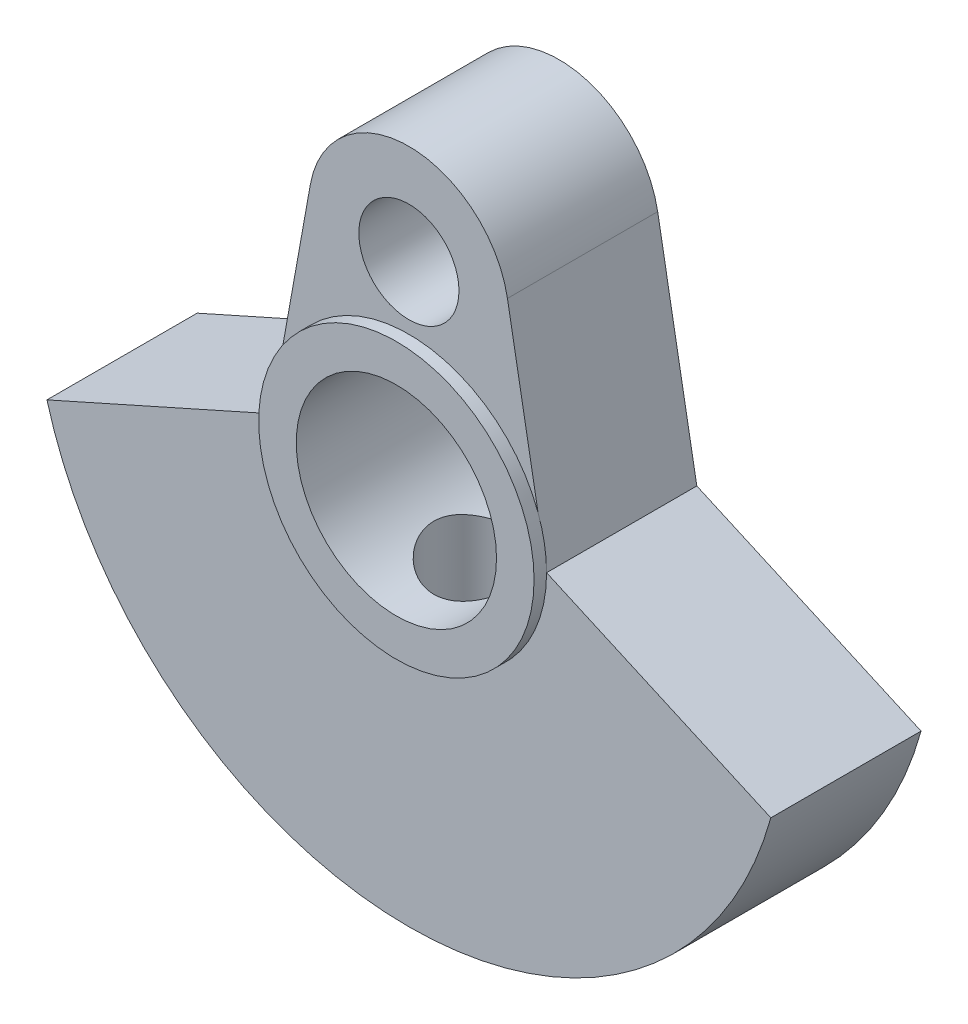
ISO-10303-21;
HEADER;
FILE_DESCRIPTION(('STEP AP214'),'2;1');
FILE_NAME('part.step','',(''),(''),'','','');
FILE_SCHEMA(('AUTOMOTIVE_DESIGN { 1 0 10303 214 1 1 1 1 }'));
ENDSEC;
DATA;
#1=APPLICATION_CONTEXT('core data for automotive mechanical design processes');
#2=APPLICATION_PROTOCOL_DEFINITION('international standard','automotive_design',2000,#1);
#3=PRODUCT_CONTEXT('',#1,'mechanical');
#4=PRODUCT('Part','Part','',(#3));
#5=PRODUCT_RELATED_PRODUCT_CATEGORY('part','',(#4));
#6=PRODUCT_DEFINITION_FORMATION('','',#4);
#7=PRODUCT_DEFINITION_CONTEXT('part definition',#1,'design');
#8=PRODUCT_DEFINITION('design','',#6,#7);
#9=PRODUCT_DEFINITION_SHAPE('','',#8);
#10=(LENGTH_UNIT() NAMED_UNIT(*) SI_UNIT(.MILLI.,.METRE.));
#11=(NAMED_UNIT(*) PLANE_ANGLE_UNIT() SI_UNIT($,.RADIAN.));
#12=(NAMED_UNIT(*) SI_UNIT($,.STERADIAN.) SOLID_ANGLE_UNIT());
#13=UNCERTAINTY_MEASURE_WITH_UNIT(LENGTH_MEASURE(1.E-05),#10,'distance_accuracy_value','');
#14=(GEOMETRIC_REPRESENTATION_CONTEXT(3) GLOBAL_UNCERTAINTY_ASSIGNED_CONTEXT((#13)) GLOBAL_UNIT_ASSIGNED_CONTEXT((#10,
#11,#12)) REPRESENTATION_CONTEXT('',''));
#15=CARTESIAN_POINT('',(0.,0.,0.));
#16=DIRECTION('',(0.,0.,1.));
#17=DIRECTION('',(1.,0.,0.));
#18=AXIS2_PLACEMENT_3D('',#15,#16,#17);
#19=CARTESIAN_POINT('',(0.,0.,6.));
#20=DIRECTION('',(0.,0.,1.));
#21=DIRECTION('',(1.,0.,0.));
#22=AXIS2_PLACEMENT_3D('',#19,#20,#21);
#23=PLANE('',#22);
#24=CARTESIAN_POINT('',(0.,0.,6.));
#25=DIRECTION('',(0.,0.,1.));
#26=DIRECTION('',(1.,0.,0.));
#27=AXIS2_PLACEMENT_3D('',#24,#25,#26);
#28=CIRCLE('',#27,5.5);
#29=CARTESIAN_POINT('',(5.15661042473575,1.91294770642237,6.));
#30=VERTEX_POINT('',#29);
#31=CARTESIAN_POINT('',(-5.15661042473575,1.91294770642237,6.));
#32=VERTEX_POINT('',#31);
#33=EDGE_CURVE('E11',#30,#32,#28,.T.);
#34=ORIENTED_EDGE('',*,*,#33,.F.);
#35=DIRECTION('',(-0.176683995072932,0.984267629196992,0.));
#36=VECTOR('',#35,1.);
#37=CARTESIAN_POINT('',(5.32830521236787,0.956473853211184,6.));
#38=LINE('',#37,#36);
#39=CARTESIAN_POINT('',(3.93707051678797,8.70673598029173,6.));
#40=VERTEX_POINT('',#39);
#41=EDGE_CURVE('E128',#30,#40,#38,.T.);
#42=ORIENTED_EDGE('',*,*,#41,.T.);
#43=CARTESIAN_POINT('',(0.,8.,6.));
#44=DIRECTION('',(0.,0.,1.));
#45=DIRECTION('',(1.,0.,0.));
#46=AXIS2_PLACEMENT_3D('',#43,#44,#45);
#47=CIRCLE('',#46,4.);
#48=CARTESIAN_POINT('',(-3.93707051678797,8.70673598029173,6.));
#49=VERTEX_POINT('',#48);
#50=EDGE_CURVE('E133',#40,#49,#47,.T.);
#51=ORIENTED_EDGE('',*,*,#50,.T.);
#52=DIRECTION('',(0.176683995072932,0.984267629196992,0.));
#53=VECTOR('',#52,1.);
#54=CARTESIAN_POINT('',(-5.32830521236787,0.956473853211183,6.));
#55=LINE('',#54,#53);
#56=EDGE_CURVE('E67',#32,#49,#55,.T.);
#57=ORIENTED_EDGE('',*,*,#56,.F.);
#58=EDGE_LOOP('',(#34,#42,#51,#57));
#59=FACE_BOUND('',#58,.T.);
#60=CARTESIAN_POINT('',(0.,8.,6.));
#61=DIRECTION('',(0.,0.,1.));
#62=DIRECTION('',(1.,0.,0.));
#63=AXIS2_PLACEMENT_3D('',#60,#61,#62);
#64=CIRCLE('',#63,2.);
#65=CARTESIAN_POINT('',(2.,8.,6.));
#66=VERTEX_POINT('',#65);
#67=EDGE_CURVE('E118',#66,#66,#64,.T.);
#68=ORIENTED_EDGE('',*,*,#67,.F.);
#69=EDGE_LOOP('',(#68));
#70=FACE_BOUND('',#69,.T.);
#71=ADVANCED_FACE('F48',(#59,#70),#23,.T.);
#72=CARTESIAN_POINT('',(5.32830521236787,0.956473853211184,6.));
#73=DIRECTION('',(-0.984267629196992,-0.176683995072932,0.));
#74=DIRECTION('',(0.176683995072932,-0.984267629196992,0.));
#75=AXIS2_PLACEMENT_3D('',#72,#73,#74);
#76=PLANE('',#75);
#77=DIRECTION('',(-0.176683995072932,0.984267629196992,0.));
#78=VECTOR('',#77,1.);
#79=CARTESIAN_POINT('',(5.32830521236787,0.956473853211184,0.));
#80=LINE('',#79,#78);
#81=CARTESIAN_POINT('',(5.5,0.,0.));
#82=VERTEX_POINT('',#81);
#83=CARTESIAN_POINT('',(3.93707051678797,8.70673598029173,0.));
#84=VERTEX_POINT('',#83);
#85=EDGE_CURVE('E175',#82,#84,#80,.T.);
#86=ORIENTED_EDGE('',*,*,#85,.T.);
#87=DIRECTION('',(0.,0.,-1.));
#88=VECTOR('',#87,1.);
#89=CARTESIAN_POINT('',(3.93707051678797,8.70673598029173,6.));
#90=LINE('',#89,#88);
#91=EDGE_CURVE('E52',#40,#84,#90,.T.);
#92=ORIENTED_EDGE('',*,*,#91,.F.);
#93=ORIENTED_EDGE('',*,*,#41,.F.);
#94=CARTESIAN_POINT('',(5.5,0.,6.));
#95=VERTEX_POINT('',#94);
#96=EDGE_CURVE('E122',#95,#30,#38,.T.);
#97=ORIENTED_EDGE('',*,*,#96,.F.);
#98=DIRECTION('',(0.,0.,-1.));
#99=VECTOR('',#98,1.);
#100=CARTESIAN_POINT('',(5.5,0.,6.));
#101=LINE('',#100,#99);
#102=EDGE_CURVE('E125',#95,#82,#101,.T.);
#103=ORIENTED_EDGE('',*,*,#102,.T.);
#104=EDGE_LOOP('',(#86,#92,#93,#97,#103));
#105=FACE_BOUND('',#104,.T.);
#106=ADVANCED_FACE('F124',(#105),#76,.F.);
#107=CARTESIAN_POINT('',(0.,8.,6.));
#108=DIRECTION('',(0.,0.,-1.));
#109=DIRECTION('',(-1.,0.,0.));
#110=AXIS2_PLACEMENT_3D('',#107,#108,#109);
#111=CYLINDRICAL_SURFACE('',#110,4.);
#112=CARTESIAN_POINT('',(0.,8.,0.));
#113=DIRECTION('',(0.,0.,1.));
#114=DIRECTION('',(1.,0.,0.));
#115=AXIS2_PLACEMENT_3D('',#112,#113,#114);
#116=CIRCLE('',#115,4.);
#117=CARTESIAN_POINT('',(-3.93707051678797,8.70673598029173,0.));
#118=VERTEX_POINT('',#117);
#119=EDGE_CURVE('E178',#84,#118,#116,.T.);
#120=ORIENTED_EDGE('',*,*,#119,.T.);
#121=DIRECTION('',(0.,0.,-1.));
#122=VECTOR('',#121,1.);
#123=CARTESIAN_POINT('',(-3.93707051678797,8.70673598029173,6.));
#124=LINE('',#123,#122);
#125=EDGE_CURVE('E207',#49,#118,#124,.T.);
#126=ORIENTED_EDGE('',*,*,#125,.F.);
#127=ORIENTED_EDGE('',*,*,#50,.F.);
#128=ORIENTED_EDGE('',*,*,#91,.T.);
#129=EDGE_LOOP('',(#120,#126,#127,#128));
#130=FACE_BOUND('',#129,.T.);
#131=ADVANCED_FACE('F216',(#130),#111,.T.);
#132=CARTESIAN_POINT('',(-5.32830521236787,0.956473853211183,6.));
#133=DIRECTION('',(-0.984267629196992,0.176683995072932,0.));
#134=DIRECTION('',(-0.176683995072932,-0.984267629196992,0.));
#135=AXIS2_PLACEMENT_3D('',#132,#133,#134);
#136=PLANE('',#135);
#137=DIRECTION('',(0.176683995072932,0.984267629196992,0.));
#138=VECTOR('',#137,1.);
#139=CARTESIAN_POINT('',(-5.32830521236787,0.956473853211183,0.));
#140=LINE('',#139,#138);
#141=CARTESIAN_POINT('',(-5.5,0.,0.));
#142=VERTEX_POINT('',#141);
#143=EDGE_CURVE('E182',#142,#118,#140,.T.);
#144=ORIENTED_EDGE('',*,*,#143,.F.);
#145=DIRECTION('',(0.,0.,-1.));
#146=VECTOR('',#145,1.);
#147=CARTESIAN_POINT('',(-5.5,0.,6.));
#148=LINE('',#147,#146);
#149=CARTESIAN_POINT('',(-5.5,0.,6.));
#150=VERTEX_POINT('',#149);
#151=EDGE_CURVE('E205',#150,#142,#148,.T.);
#152=ORIENTED_EDGE('',*,*,#151,.F.);
#153=EDGE_CURVE('E161',#150,#32,#55,.T.);
#154=ORIENTED_EDGE('',*,*,#153,.T.);
#155=ORIENTED_EDGE('',*,*,#56,.T.);
#156=ORIENTED_EDGE('',*,*,#125,.T.);
#157=EDGE_LOOP('',(#144,#152,#154,#155,#156));
#158=FACE_BOUND('',#157,.T.);
#159=ADVANCED_FACE('F222',(#158),#136,.T.);
#160=CARTESIAN_POINT('',(-0.914524728224359,2.0478111550385,6.));
#161=DIRECTION('',(0.407771042759929,-0.9130842111692,0.));
#162=DIRECTION('',(0.9130842111692,0.407771042759929,0.));
#163=AXIS2_PLACEMENT_3D('',#160,#161,#162);
#164=PLANE('',#163);
#165=DIRECTION('',(-0.9130842111692,-0.407771042759929,0.));
#166=VECTOR('',#165,1.);
#167=CARTESIAN_POINT('',(-0.914524728224359,2.0478111550385,0.));
#168=LINE('',#167,#166);
#169=CARTESIAN_POINT('',(-14.456832294801,-4.,0.));
#170=VERTEX_POINT('',#169);
#171=EDGE_CURVE('E186',#142,#170,#168,.T.);
#172=ORIENTED_EDGE('',*,*,#171,.T.);
#173=DIRECTION('',(0.,0.,-1.));
#174=VECTOR('',#173,1.);
#175=CARTESIAN_POINT('',(-14.456832294801,-4.,6.));
#176=LINE('',#175,#174);
#177=CARTESIAN_POINT('',(-14.456832294801,-4.,6.));
#178=VERTEX_POINT('',#177);
#179=EDGE_CURVE('E201',#178,#170,#176,.T.);
#180=ORIENTED_EDGE('',*,*,#179,.F.);
#181=DIRECTION('',(-0.9130842111692,-0.407771042759929,0.));
#182=VECTOR('',#181,1.);
#183=CARTESIAN_POINT('',(-0.914524728224359,2.0478111550385,6.));
#184=LINE('',#183,#182);
#185=EDGE_CURVE('E164',#150,#178,#184,.T.);
#186=ORIENTED_EDGE('',*,*,#185,.F.);
#187=ORIENTED_EDGE('',*,*,#151,.T.);
#188=EDGE_LOOP('',(#172,#180,#186,#187));
#189=FACE_BOUND('',#188,.T.);
#190=ADVANCED_FACE('F227',(#189),#164,.F.);
#191=CARTESIAN_POINT('',(0.,0.,6.));
#192=DIRECTION('',(0.,0.,-1.));
#193=DIRECTION('',(-1.,0.,0.));
#194=AXIS2_PLACEMENT_3D('',#191,#192,#193);
#195=CYLINDRICAL_SURFACE('',#194,15.);
#196=CARTESIAN_POINT('',(0.,-15.,5.));
#197=CARTESIAN_POINT('',(-0.111808835669284,-14.9999983574254,4.99999529029309));
#198=CARTESIAN_POINT('',(-0.22368597927628,-14.9987367072719,4.99059246203753));
#199=CARTESIAN_POINT('',(-0.444322725138079,-14.993825111269,4.95323365095044));
#200=CARTESIAN_POINT('',(-0.553079022333037,-14.9901727244172,4.92525870510285));
#201=CARTESIAN_POINT('',(-0.764248312626984,-14.9808907984907,4.85159828245855));
#202=CARTESIAN_POINT('',(-0.866665683058494,-14.9752626421097,4.80592518896156));
#203=CARTESIAN_POINT('',(-1.0623638950303,-14.9626538666039,4.69819308619372));
#204=CARTESIAN_POINT('',(-1.15564620633702,-14.9556734655857,4.63613671883354));
#205=CARTESIAN_POINT('',(-1.33102582250468,-14.9410899478996,4.49698673839582));
#206=CARTESIAN_POINT('',(-1.41305798549586,-14.9334835816211,4.41981135499153));
#207=CARTESIAN_POINT('',(-1.56304735673102,-14.9185313755795,4.25278981092335));
#208=CARTESIAN_POINT('',(-1.63100381997221,-14.9111855496234,4.16294298000419));
#209=CARTESIAN_POINT('',(-1.75115902268907,-14.8975543544019,3.97270087705497));
#210=CARTESIAN_POINT('',(-1.80329607482578,-14.8912731776576,3.87226631752138));
#211=CARTESIAN_POINT('',(-1.8899384500729,-14.8805258737923,3.66396893276321));
#212=CARTESIAN_POINT('',(-1.92444453245278,-14.8760596685121,3.55610642764669));
#213=CARTESIAN_POINT('',(-1.97464606772174,-14.8694793656867,3.33669418949834));
#214=CARTESIAN_POINT('',(-1.99045204228506,-14.8673514537014,3.22517016546708));
#215=CARTESIAN_POINT('',(-2.00314680548117,-14.8656465160931,3.00103382039405));
#216=CARTESIAN_POINT('',(-2.00003645633601,-14.866069374204,2.8884215491891));
#217=CARTESIAN_POINT('',(-1.97507745939234,-14.8694055577299,2.66607886997207));
#218=CARTESIAN_POINT('',(-1.95335097531762,-14.8723026462234,2.5563344701143));
#219=CARTESIAN_POINT('',(-1.89196724634371,-14.8802355277475,2.34206316323991));
#220=CARTESIAN_POINT('',(-1.85230959261457,-14.8852713695413,2.23753637524499));
#221=CARTESIAN_POINT('',(-1.75605929143191,-14.8969326111103,2.0362903652928));
#222=CARTESIAN_POINT('',(-1.69941397913749,-14.903562941239,1.93959662880569));
#223=CARTESIAN_POINT('',(-1.57083393344289,-14.9176623621993,1.75704091808234));
#224=CARTESIAN_POINT('',(-1.49889840502385,-14.9251314966353,1.67117950744583));
#225=CARTESIAN_POINT('',(-1.34110490026362,-14.9401389923359,1.5120169874181));
#226=CARTESIAN_POINT('',(-1.25514170702645,-14.947677435412,1.43882015729767));
#227=CARTESIAN_POINT('',(-1.07209417013341,-14.9619192381826,1.30787795507161));
#228=CARTESIAN_POINT('',(-0.975009794442369,-14.9686225954715,1.25013262747648));
#229=CARTESIAN_POINT('',(-0.77239221973047,-14.9804439374358,1.15173088230526));
#230=CARTESIAN_POINT('',(-0.666855578841231,-14.9855612720896,1.11108146895369));
#231=CARTESIAN_POINT('',(-0.45037092433625,-14.9936282590407,1.04811068102766));
#232=CARTESIAN_POINT('',(-0.339423199542257,-14.9965780268993,1.02578832936061));
#233=CARTESIAN_POINT('',(-0.116166903325644,-14.9999624137686,1.00024156722888));
#234=CARTESIAN_POINT('',(-0.00387503454704295,-15.0004159384905,0.996873598216514));
#235=CARTESIAN_POINT('',(0.219671617218717,-14.9988079153852,1.00895166412718));
#236=CARTESIAN_POINT('',(0.330926425345664,-14.996746428686,1.02439724178236));
#237=CARTESIAN_POINT('',(0.548813715572937,-14.990351753581,1.07354465338398));
#238=CARTESIAN_POINT('',(0.655462016512044,-14.9860271430292,1.10717756832215));
#239=CARTESIAN_POINT('',(0.861605098793559,-14.9755900925429,1.19167296593709));
#240=CARTESIAN_POINT('',(0.961099607015637,-14.9694775843944,1.24253610601325));
#241=CARTESIAN_POINT('',(1.15074887861608,-14.9560983737007,1.36039215558331));
#242=CARTESIAN_POINT('',(1.2408458143966,-14.9488251504572,1.42747736571333));
#243=CARTESIAN_POINT('',(1.4085529469919,-14.9339572870998,1.57574332922425));
#244=CARTESIAN_POINT('',(1.48616257662378,-14.9263626324062,1.65692472251643));
#245=CARTESIAN_POINT('',(1.62720549423098,-14.9116490247351,1.83171314263955));
#246=CARTESIAN_POINT('',(1.69054327608938,-14.904533487753,1.92539756673816));
#247=CARTESIAN_POINT('',(1.80058351078814,-14.8916413300182,2.12215941028093));
#248=CARTESIAN_POINT('',(1.84728633510346,-14.8858646793678,2.22523661991038));
#249=CARTESIAN_POINT('',(1.92257836500746,-14.8763281178008,2.43755724202769));
#250=CARTESIAN_POINT('',(1.95122028846795,-14.872562342326,2.54678168521081));
#251=CARTESIAN_POINT('',(1.98974667143959,-14.8674574869829,2.76854363212876));
#252=CARTESIAN_POINT('',(1.99963213426782,-14.8661182773134,2.88108095832443));
#253=CARTESIAN_POINT('',(2.00034485806189,-14.8660223129545,3.10532349085351));
#254=CARTESIAN_POINT('',(1.99132219194493,-14.8672452228252,3.21702824096424));
#255=CARTESIAN_POINT('',(1.95479376686689,-14.872091838742,3.43731787510387));
#256=CARTESIAN_POINT('',(1.92728801483269,-14.8757155438883,3.54590276030198));
#257=CARTESIAN_POINT('',(1.85462310332207,-14.8849489027276,3.75684368325159));
#258=CARTESIAN_POINT('',(1.80947220819041,-14.890557626594,3.85920261111686));
#259=CARTESIAN_POINT('',(1.70281342759737,-14.9031304571282,4.05491588382606));
#260=CARTESIAN_POINT('',(1.64130522630429,-14.910094589966,4.14827005475604));
#261=CARTESIAN_POINT('',(1.50312448509508,-14.9246596718306,4.32408964992841));
#262=CARTESIAN_POINT('',(1.42634027226901,-14.9322650575408,4.40646694775513));
#263=CARTESIAN_POINT('',(1.26002169349824,-14.9472171900166,4.55722321636155));
#264=CARTESIAN_POINT('',(1.17048434072978,-14.9545638756898,4.62559889875025));
#265=CARTESIAN_POINT('',(0.980752987852823,-14.9682063513753,4.74666713846652));
#266=CARTESIAN_POINT('',(0.880514620743967,-14.9744974642689,4.79929066655524));
#267=CARTESIAN_POINT('',(0.67259240958733,-14.9852732065897,4.88688059854508));
#268=CARTESIAN_POINT('',(0.564916678969891,-14.9897597692431,4.92186590862486));
#269=CARTESIAN_POINT('',(0.38058840809842,-14.9953572174327,4.96494800638518));
#270=CARTESIAN_POINT('',(0.305091081955779,-14.9970896363507,4.97807324352364));
#271=CARTESIAN_POINT('',(0.153073171616112,-14.9994115849077,4.99560081416547));
#272=CARTESIAN_POINT('',(0.0765525964512404,-15.000001124628,5.0000032246136));
#273=CARTESIAN_POINT('',(0.,-15.,5.));
#274=B_SPLINE_CURVE_WITH_KNOTS('',3,(#196,#197,#198,#199,#200,#201,#202,#203,#204,#205,#206,
#207,#208,#209,#210,#211,#212,#213,#214,#215,#216,#217,#218,#219,#220,#221,#222,#223,#224,#225,
#226,#227,#228,#229,#230,#231,#232,#233,#234,#235,#236,#237,#238,#239,#240,#241,#242,#243,#244,
#245,#246,#247,#248,#249,#250,#251,#252,#253,#254,#255,#256,#257,#258,#259,#260,#261,#262,#263,
#264,#265,#266,#267,#268,#269,#270,#271,#272,#273),.UNSPECIFIED.,.T.,.F.,(4,2,2,2,2,2,2,2,2,2,2,
2,2,2,2,2,2,2,2,2,2,2,2,2,2,2,2,2,2,2,2,2,2,2,2,2,2,2,4),(0.,0.335146851305743,
0.670636430885044,1.0058916928274,1.34109292564035,1.67815978443559,2.01524447904836,
2.35362721511647,2.69199537766204,3.02835355914359,3.3646964092492,3.69884885098043,
4.0330089117585,4.36821583137897,4.70344018443797,5.04130544484849,5.37917167852296,
5.71717620202538,6.05516270391743,6.39058584992061,6.72600084354478,7.06015363396463,
7.39431917503546,7.73043274769884,8.06656158258761,8.4048770453545,8.74318495273048,
9.08050074735454,9.41779849783634,9.75242927496624,10.0870599266875,10.4215340370262,
10.756014605959,11.0930366783511,11.4301378125116,11.7686952667452,12.1068890499242,
12.3363573904731,12.5658237068544),.UNSPECIFIED.);
#275=CARTESIAN_POINT('',(0.,-15.,5.));
#276=VERTEX_POINT('',#275);
#277=EDGE_CURVE('E452',#276,#276,#274,.T.);
#278=ORIENTED_EDGE('',*,*,#277,.F.);
#279=EDGE_LOOP('',(#278));
#280=FACE_BOUND('',#279,.T.);
#281=CARTESIAN_POINT('',(0.,0.,0.));
#282=DIRECTION('',(0.,0.,1.));
#283=DIRECTION('',(1.,0.,0.));
#284=AXIS2_PLACEMENT_3D('',#281,#282,#283);
#285=CIRCLE('',#284,15.);
#286=CARTESIAN_POINT('',(14.456832294801,-3.99999999999999,0.));
#287=VERTEX_POINT('',#286);
#288=EDGE_CURVE('E189',#170,#287,#285,.T.);
#289=ORIENTED_EDGE('',*,*,#288,.T.);
#290=DIRECTION('',(0.,0.,-1.));
#291=VECTOR('',#290,1.);
#292=CARTESIAN_POINT('',(14.456832294801,-3.99999999999999,6.));
#293=LINE('',#292,#291);
#294=CARTESIAN_POINT('',(14.456832294801,-3.99999999999999,6.));
#295=VERTEX_POINT('',#294);
#296=EDGE_CURVE('E140',#295,#287,#293,.T.);
#297=ORIENTED_EDGE('',*,*,#296,.F.);
#298=CARTESIAN_POINT('',(0.,0.,6.));
#299=DIRECTION('',(0.,0.,1.));
#300=DIRECTION('',(1.,0.,0.));
#301=AXIS2_PLACEMENT_3D('',#298,#299,#300);
#302=CIRCLE('',#301,15.);
#303=EDGE_CURVE('E113',#178,#295,#302,.T.);
#304=ORIENTED_EDGE('',*,*,#303,.F.);
#305=ORIENTED_EDGE('',*,*,#179,.T.);
#306=EDGE_LOOP('',(#289,#297,#304,#305));
#307=FACE_BOUND('',#306,.T.);
#308=ADVANCED_FACE('F267',(#280,#307),#195,.T.);
#309=CARTESIAN_POINT('',(0.914524728224359,2.04781115503851,6.));
#310=DIRECTION('',(0.407771042759929,0.9130842111692,0.));
#311=DIRECTION('',(-0.9130842111692,0.407771042759929,0.));
#312=AXIS2_PLACEMENT_3D('',#309,#310,#311);
#313=PLANE('',#312);
#314=DIRECTION('',(0.9130842111692,-0.407771042759929,0.));
#315=VECTOR('',#314,1.);
#316=CARTESIAN_POINT('',(0.914524728224359,2.04781115503851,0.));
#317=LINE('',#316,#315);
#318=EDGE_CURVE('E138',#82,#287,#317,.T.);
#319=ORIENTED_EDGE('',*,*,#318,.F.);
#320=ORIENTED_EDGE('',*,*,#102,.F.);
#321=DIRECTION('',(0.9130842111692,-0.407771042759929,0.));
#322=VECTOR('',#321,1.);
#323=CARTESIAN_POINT('',(0.914524728224359,2.04781115503851,6.));
#324=LINE('',#323,#322);
#325=EDGE_CURVE('E107',#95,#295,#324,.T.);
#326=ORIENTED_EDGE('',*,*,#325,.T.);
#327=ORIENTED_EDGE('',*,*,#296,.T.);
#328=EDGE_LOOP('',(#319,#320,#326,#327));
#329=FACE_BOUND('',#328,.T.);
#330=ADVANCED_FACE('F136',(#329),#313,.T.);
#331=CARTESIAN_POINT('',(0.,0.,6.));
#332=DIRECTION('',(0.,0.,-1.));
#333=DIRECTION('',(-1.,0.,0.));
#334=AXIS2_PLACEMENT_3D('',#331,#332,#333);
#335=CYLINDRICAL_SURFACE('',#334,4.);
#336=CARTESIAN_POINT('',(0.,-4.,1.));
#337=CARTESIAN_POINT('',(-0.105143925902467,-3.99999426810082,1.00000660463438));
#338=CARTESIAN_POINT('',(-0.210413199395125,-3.99580982039513,1.00834014624211));
#339=CARTESIAN_POINT('',(-0.417840470537792,-3.97948312074314,1.04130576068308));
#340=CARTESIAN_POINT('',(-0.519992173427259,-3.96732575657839,1.06596878599563));
#341=CARTESIAN_POINT('',(-0.717867089760898,-3.93632558806751,1.13038761723326));
#342=CARTESIAN_POINT('',(-0.813613605878293,-3.91750878355075,1.17008476849594));
#343=CARTESIAN_POINT('',(-0.996945233613197,-3.87491553031523,1.26314124272997));
#344=CARTESIAN_POINT('',(-1.08453098798012,-3.8511394726705,1.31649948849773));
#345=CARTESIAN_POINT('',(-1.25501563552382,-3.79912516516124,1.43903449897057));
#346=CARTESIAN_POINT('',(-1.33731042224422,-3.77070398255074,1.50897295847928));
#347=CARTESIAN_POINT('',(-1.48955888973396,-3.71319940493486,1.66104295849407));
#348=CARTESIAN_POINT('',(-1.55950316621353,-3.68411552418069,1.74318370354488));
#349=CARTESIAN_POINT('',(-1.69050400090056,-3.62597902394695,1.92496669904676));
#350=CARTESIAN_POINT('',(-1.75045067110327,-3.59710373940264,2.02547219669183));
#351=CARTESIAN_POINT('',(-1.85233645378139,-3.54571957544641,2.23673467197243));
#352=CARTESIAN_POINT('',(-1.89428842993267,-3.52320615213979,2.3474842574455));
#353=CARTESIAN_POINT('',(-1.95626488437718,-3.48915734075617,2.56933021084384));
#354=CARTESIAN_POINT('',(-1.97745171416088,-3.47704543167427,2.68000890413479));
#355=CARTESIAN_POINT('',(-2.00085398661769,-3.46363779897055,2.90395767555895));
#356=CARTESIAN_POINT('',(-2.00308817674615,-3.46233138686576,3.01722508174231));
#357=CARTESIAN_POINT('',(-1.98937457434459,-3.47021860514497,3.22857204863074));
#358=CARTESIAN_POINT('',(-1.97556911907364,-3.47817527324027,3.3268480624461));
#359=CARTESIAN_POINT('',(-1.93387969811386,-3.50152457467701,3.51944381874608));
#360=CARTESIAN_POINT('',(-1.9059912477953,-3.51691957663553,3.61376229061063));
#361=CARTESIAN_POINT('',(-1.83641956077201,-3.55374952825482,3.79845826513132));
#362=CARTESIAN_POINT('',(-1.79443013423199,-3.57531681327997,3.88869279757158));
#363=CARTESIAN_POINT('',(-1.698083375336,-3.62206808562807,4.06126858518002));
#364=CARTESIAN_POINT('',(-1.64372048762493,-3.64725369560381,4.14360627120018));
#365=CARTESIAN_POINT('',(-1.51613210982558,-3.70226315806572,4.30904250548645));
#366=CARTESIAN_POINT('',(-1.44138891673856,-3.73227020473492,4.39091374715232));
#367=CARTESIAN_POINT('',(-1.27911115748275,-3.79095246600814,4.5414708371818));
#368=CARTESIAN_POINT('',(-1.19157051314857,-3.81962703917602,4.61015038406777));
#369=CARTESIAN_POINT('',(-1.0010330116637,-3.87403974565928,4.73537132205946));
#370=CARTESIAN_POINT('',(-0.897507183198818,-3.89957968324015,4.79120094489148));
#371=CARTESIAN_POINT('',(-0.680932430977594,-3.94315762242485,4.88419405808602));
#372=CARTESIAN_POINT('',(-0.567891152530552,-3.96120157887106,4.92137237003033));
#373=CARTESIAN_POINT('',(-0.345532983321404,-3.98648667482871,4.97295080743335));
#374=CARTESIAN_POINT('',(-0.236683061096652,-3.9944987660262,4.98898247149356));
#375=CARTESIAN_POINT('',(-0.017559199898703,-4.00146026918207,5.00292946226897));
#376=CARTESIAN_POINT('',(0.0927140397398175,-4.00041397442637,5.00085337127894));
#377=CARTESIAN_POINT('',(0.302465943971974,-3.9898238450687,4.97958662316251));
#378=CARTESIAN_POINT('',(0.40211881609986,-3.98094491376337,4.96173493454001));
#379=CARTESIAN_POINT('',(0.596813784603882,-3.9564434262968,4.91152385620976));
#380=CARTESIAN_POINT('',(0.691855371382174,-3.94082012668824,4.87916286709301));
#381=CARTESIAN_POINT('',(0.877777216899145,-3.90368502827176,4.80000306713393));
#382=CARTESIAN_POINT('',(0.968460794011606,-3.88201763539261,4.75281789976743));
#383=CARTESIAN_POINT('',(1.14092272339854,-3.83487948634835,4.64578492870687));
#384=CARTESIAN_POINT('',(1.22269725955318,-3.80940711133877,4.58593173080921));
#385=CARTESIAN_POINT('',(1.38353537857843,-3.75416442672396,4.44847914933857));
#386=CARTESIAN_POINT('',(1.46154415563805,-3.72421769686998,4.36971426310971));
#387=CARTESIAN_POINT('',(1.60371264223771,-3.6652478321764,4.20014969744455));
#388=CARTESIAN_POINT('',(1.66786277142375,-3.63622534800094,4.10934176230416));
#389=CARTESIAN_POINT('',(1.78341582895804,-3.58102384412979,3.91271269165405));
#390=CARTESIAN_POINT('',(1.8340509916005,-3.55505059178121,3.80637746781104));
#391=CARTESIAN_POINT('',(1.91616565186941,-3.51148144588269,3.58497986485007));
#392=CARTESIAN_POINT('',(1.94766983173403,-3.493874764435,3.46992894706622));
#393=CARTESIAN_POINT('',(1.98772337493374,-3.47123002051604,3.24617955423059));
#394=CARTESIAN_POINT('',(1.9981859928109,-3.4651476693013,3.13793149312952));
#395=CARTESIAN_POINT('',(2.0013783087524,-3.46330709283207,2.92110586567095));
#396=CARTESIAN_POINT('',(1.99411569324648,-3.4675443925278,2.81252846252428));
#397=CARTESIAN_POINT('',(1.96385225118662,-3.48475724102153,2.60903299693313));
#398=CARTESIAN_POINT('',(1.94241662868607,-3.49686188965317,2.51379905971052));
#399=CARTESIAN_POINT('',(1.88635071644882,-3.52742032375305,2.32838376115127));
#400=CARTESIAN_POINT('',(1.85171618231984,-3.54587615139337,2.23820403581594));
#401=CARTESIAN_POINT('',(1.76763149060113,-3.58857060729071,2.05875029802693));
#402=CARTESIAN_POINT('',(1.7173422756314,-3.61311444791841,1.96994419634194));
#403=CARTESIAN_POINT('',(1.60430194327478,-3.66470663269721,1.80145092763748));
#404=CARTESIAN_POINT('',(1.54154434248312,-3.69175627591221,1.72176853895778));
#405=CARTESIAN_POINT('',(1.39640665332275,-3.74924646316184,1.56371603529065));
#406=CARTESIAN_POINT('',(1.31256884599452,-3.77969966613256,1.48668179529942));
#407=CARTESIAN_POINT('',(1.13230961246639,-3.83755504519861,1.34747403312946));
#408=CARTESIAN_POINT('',(1.03588144661039,-3.8649555725239,1.28530852106019));
#409=CARTESIAN_POINT('',(0.831863193565891,-3.91396019133075,1.17752727457586));
#410=CARTESIAN_POINT('',(0.724199007553461,-3.93552192987866,1.13203166152706));
#411=CARTESIAN_POINT('',(0.501484202276173,-3.97002682597974,1.06038366448518));
#412=CARTESIAN_POINT('',(0.3864555991782,-3.98299446726136,1.03417630638857));
#413=CARTESIAN_POINT('',(0.22520389298179,-3.99390923826956,1.01220517782852));
#414=CARTESIAN_POINT('',(0.180323758883129,-3.99618730680502,1.00763471826732));
#415=CARTESIAN_POINT('',(0.090303463610183,-3.99923393953631,1.00153066897183));
#416=CARTESIAN_POINT('',(0.0451632952932568,-4.00000246206762,0.999997163059583));
#417=CARTESIAN_POINT('',(0.,-4.,1.));
#418=B_SPLINE_CURVE_WITH_KNOTS('',3,(#336,#337,#338,#339,#340,#341,#342,#343,#344,#345,#346,
#347,#348,#349,#350,#351,#352,#353,#354,#355,#356,#357,#358,#359,#360,#361,#362,#363,#364,#365,
#366,#367,#368,#369,#370,#371,#372,#373,#374,#375,#376,#377,#378,#379,#380,#381,#382,#383,#384,
#385,#386,#387,#388,#389,#390,#391,#392,#393,#394,#395,#396,#397,#398,#399,#400,#401,#402,#403,
#404,#405,#406,#407,#408,#409,#410,#411,#412,#413,#414,#415,#416,#417),.UNSPECIFIED.,.T.,.F.,(4,
2,2,2,2,2,2,2,2,2,2,2,2,2,2,2,2,2,2,2,2,2,2,2,2,2,2,2,2,2,2,2,2,2,2,2,2,2,2,2,4),(0.,
0.315248514840585,0.631096299418395,0.945724310984597,1.26032752116314,1.59396351743618,
1.92785247530807,2.28763452861505,2.64715895796562,2.98516024280459,3.32282714658041,
3.62011424818641,3.91749607851357,4.22180480336975,4.52625042520444,4.86929882667757,
5.21251069197373,5.57166044428881,5.93052433824559,6.25966580942691,6.58865129022952,
6.89213813012244,7.19565843261863,7.50785712055797,7.82018901496678,8.16319221288837,
8.50643177230863,8.86629364323451,9.22569023890901,9.55058615006093,9.87534119729357,
10.1691586049771,10.463070575767,10.7767291356057,11.0905512228726,11.4425048551434,
11.7946476676249,12.1492802732705,12.502898172423,12.6383056026783,12.7737167702213),.UNSPECIFIED.);
#419=CARTESIAN_POINT('',(0.,-4.,1.));
#420=VERTEX_POINT('',#419);
#421=EDGE_CURVE('E458',#420,#420,#418,.T.);
#422=ORIENTED_EDGE('',*,*,#421,.F.);
#423=EDGE_LOOP('',(#422));
#424=FACE_BOUND('',#423,.T.);
#425=CARTESIAN_POINT('',(0.,0.,0.));
#426=DIRECTION('',(0.,0.,1.));
#427=DIRECTION('',(1.,0.,0.));
#428=AXIS2_PLACEMENT_3D('',#425,#426,#427);
#429=CIRCLE('',#428,4.);
#430=CARTESIAN_POINT('',(4.,0.,0.));
#431=VERTEX_POINT('',#430);
#432=EDGE_CURVE('E154',#431,#431,#429,.T.);
#433=ORIENTED_EDGE('',*,*,#432,.F.);
#434=EDGE_LOOP('',(#433));
#435=FACE_BOUND('',#434,.T.);
#436=CARTESIAN_POINT('',(0.,0.,6.5));
#437=DIRECTION('',(0.,0.,1.));
#438=DIRECTION('',(1.,0.,0.));
#439=AXIS2_PLACEMENT_3D('',#436,#437,#438);
#440=CIRCLE('',#439,4.);
#441=CARTESIAN_POINT('',(4.,0.,6.5));
#442=VERTEX_POINT('',#441);
#443=EDGE_CURVE('E156',#442,#442,#440,.T.);
#444=ORIENTED_EDGE('',*,*,#443,.T.);
#445=EDGE_LOOP('',(#444));
#446=FACE_BOUND('',#445,.T.);
#447=ADVANCED_FACE('F50',(#424,#435,#446),#335,.F.);
#448=CARTESIAN_POINT('',(0.,8.,6.));
#449=DIRECTION('',(0.,0.,-1.));
#450=DIRECTION('',(-1.,0.,0.));
#451=AXIS2_PLACEMENT_3D('',#448,#449,#450);
#452=CYLINDRICAL_SURFACE('',#451,2.);
#453=ORIENTED_EDGE('',*,*,#67,.T.);
#454=EDGE_LOOP('',(#453));
#455=FACE_BOUND('',#454,.T.);
#456=CARTESIAN_POINT('',(0.,8.,0.));
#457=DIRECTION('',(0.,0.,1.));
#458=DIRECTION('',(1.,0.,0.));
#459=AXIS2_PLACEMENT_3D('',#456,#457,#458);
#460=CIRCLE('',#459,2.);
#461=CARTESIAN_POINT('',(2.,8.,0.));
#462=VERTEX_POINT('',#461);
#463=EDGE_CURVE('E195',#462,#462,#460,.T.);
#464=ORIENTED_EDGE('',*,*,#463,.F.);
#465=EDGE_LOOP('',(#464));
#466=FACE_BOUND('',#465,.T.);
#467=ADVANCED_FACE('F251',(#455,#466),#452,.F.);
#468=EDGE_CURVE('E58',#150,#95,#28,.T.);
#469=ORIENTED_EDGE('',*,*,#468,.F.);
#470=ORIENTED_EDGE('',*,*,#185,.T.);
#471=ORIENTED_EDGE('',*,*,#303,.T.);
#472=ORIENTED_EDGE('',*,*,#325,.F.);
#473=EDGE_LOOP('',(#469,#470,#471,#472));
#474=FACE_BOUND('',#473,.T.);
#475=ADVANCED_FACE('F109',(#474),#23,.T.);
#476=CARTESIAN_POINT('',(0.,0.,0.));
#477=DIRECTION('',(0.,0.,1.));
#478=DIRECTION('',(1.,0.,0.));
#479=AXIS2_PLACEMENT_3D('',#476,#477,#478);
#480=PLANE('',#479);
#481=ORIENTED_EDGE('',*,*,#432,.T.);
#482=EDGE_LOOP('',(#481));
#483=FACE_BOUND('',#482,.T.);
#484=ORIENTED_EDGE('',*,*,#85,.F.);
#485=ORIENTED_EDGE('',*,*,#318,.T.);
#486=ORIENTED_EDGE('',*,*,#288,.F.);
#487=ORIENTED_EDGE('',*,*,#171,.F.);
#488=ORIENTED_EDGE('',*,*,#143,.T.);
#489=ORIENTED_EDGE('',*,*,#119,.F.);
#490=EDGE_LOOP('',(#484,#485,#486,#487,#488,#489));
#491=FACE_BOUND('',#490,.T.);
#492=ORIENTED_EDGE('',*,*,#463,.T.);
#493=EDGE_LOOP('',(#492));
#494=FACE_BOUND('',#493,.T.);
#495=ADVANCED_FACE('F218',(#483,#491,#494),#480,.F.);
#496=CARTESIAN_POINT('',(0.,0.,6.));
#497=DIRECTION('',(0.,0.,1.));
#498=DIRECTION('',(1.,0.,0.));
#499=AXIS2_PLACEMENT_3D('',#496,#497,#498);
#500=PLANE('',#499);
#501=EDGE_CURVE('E145',#95,#30,#28,.T.);
#502=ORIENTED_EDGE('',*,*,#501,.F.);
#503=ORIENTED_EDGE('',*,*,#96,.T.);
#504=EDGE_LOOP('',(#502,#503));
#505=FACE_BOUND('',#504,.T.);
#506=ADVANCED_FACE('F148',(#505),#500,.F.);
#507=CARTESIAN_POINT('',(0.,0.,6.5));
#508=DIRECTION('',(0.,0.,1.));
#509=DIRECTION('',(1.,0.,0.));
#510=AXIS2_PLACEMENT_3D('',#507,#508,#509);
#511=PLANE('',#510);
#512=CARTESIAN_POINT('',(0.,0.,6.5));
#513=DIRECTION('',(0.,0.,1.));
#514=DIRECTION('',(1.,0.,0.));
#515=AXIS2_PLACEMENT_3D('',#512,#513,#514);
#516=CIRCLE('',#515,5.5);
#517=CARTESIAN_POINT('',(5.5,0.,6.5));
#518=VERTEX_POINT('',#517);
#519=EDGE_CURVE('E150',#518,#518,#516,.T.);
#520=ORIENTED_EDGE('',*,*,#519,.T.);
#521=EDGE_LOOP('',(#520));
#522=FACE_BOUND('',#521,.T.);
#523=ORIENTED_EDGE('',*,*,#443,.F.);
#524=EDGE_LOOP('',(#523));
#525=FACE_BOUND('',#524,.T.);
#526=ADVANCED_FACE('F231',(#522,#525),#511,.T.);
#527=ORIENTED_EDGE('',*,*,#153,.F.);
#528=EDGE_CURVE('E60',#32,#150,#28,.T.);
#529=ORIENTED_EDGE('',*,*,#528,.F.);
#530=EDGE_LOOP('',(#527,#529));
#531=FACE_BOUND('',#530,.T.);
#532=ADVANCED_FACE('F229',(#531),#500,.F.);
#533=CARTESIAN_POINT('',(0.,0.,6.5));
#534=DIRECTION('',(0.,0.,-1.));
#535=DIRECTION('',(-1.,0.,0.));
#536=AXIS2_PLACEMENT_3D('',#533,#534,#535);
#537=CYLINDRICAL_SURFACE('',#536,5.5);
#538=ORIENTED_EDGE('',*,*,#519,.F.);
#539=EDGE_LOOP('',(#538));
#540=FACE_BOUND('',#539,.T.);
#541=ORIENTED_EDGE('',*,*,#501,.T.);
#542=ORIENTED_EDGE('',*,*,#33,.T.);
#543=ORIENTED_EDGE('',*,*,#528,.T.);
#544=ORIENTED_EDGE('',*,*,#468,.T.);
#545=EDGE_LOOP('',(#541,#542,#543,#544));
#546=FACE_BOUND('',#545,.T.);
#547=ADVANCED_FACE('F144',(#540,#546),#537,.T.);
#548=CARTESIAN_POINT('',(0.,-15.001,3.));
#549=DIRECTION('',(0.,1.,0.));
#550=DIRECTION('',(0.,0.,1.));
#551=AXIS2_PLACEMENT_3D('',#548,#549,#550);
#552=CYLINDRICAL_SURFACE('',#551,2.);
#553=ORIENTED_EDGE('',*,*,#277,.T.);
#554=EDGE_LOOP('',(#553));
#555=FACE_BOUND('',#554,.T.);
#556=ORIENTED_EDGE('',*,*,#421,.T.);
#557=EDGE_LOOP('',(#556));
#558=FACE_BOUND('',#557,.T.);
#559=ADVANCED_FACE('F237',(#555,#558),#552,.F.);
#560=CLOSED_SHELL('',(#71,#106,#131,#159,#190,#308,#330,#447,#467,#475,#495,#506,#526,#532,#547,#559));
#561=MANIFOLD_SOLID_BREP('B2',#560);
#562=ADVANCED_BREP_SHAPE_REPRESENTATION('',(#18,#561),#14);
#563=SHAPE_DEFINITION_REPRESENTATION(#9,#562);
ENDSEC;
END-ISO-10303-21;
